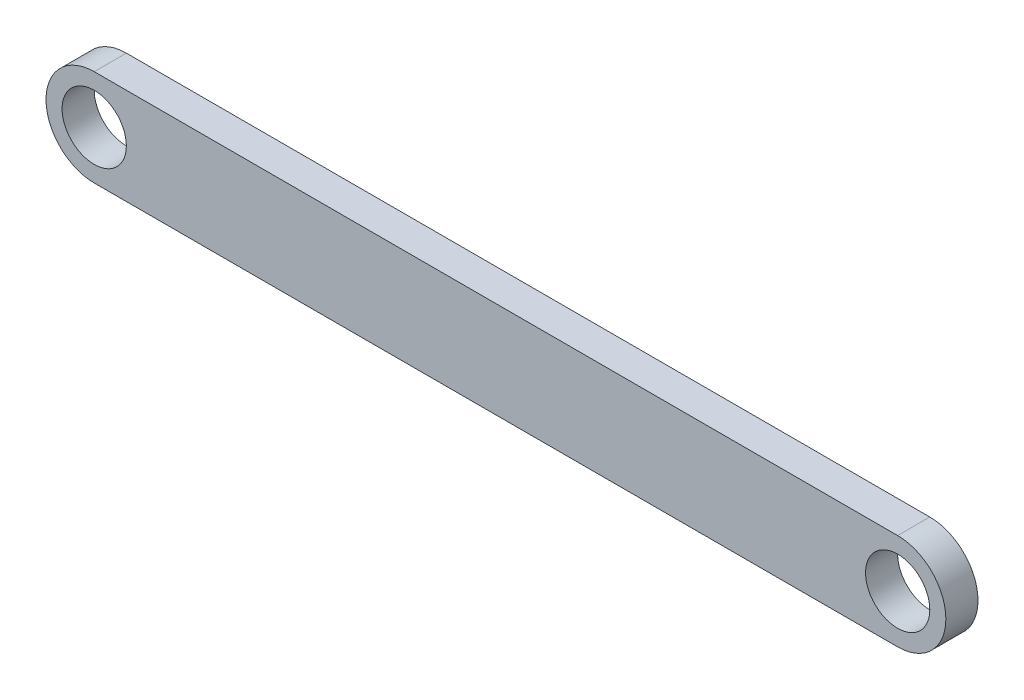
ISO-10303-21;
HEADER;
FILE_DESCRIPTION(('STEP AP214'),'2;1');
FILE_NAME('part.step','',(''),(''),'','','');
FILE_SCHEMA(('AUTOMOTIVE_DESIGN { 1 0 10303 214 1 1 1 1 }'));
ENDSEC;
DATA;
#1=APPLICATION_CONTEXT('core data for automotive mechanical design processes');
#2=APPLICATION_PROTOCOL_DEFINITION('international standard','automotive_design',2000,#1);
#3=PRODUCT_CONTEXT('',#1,'mechanical');
#4=PRODUCT('Part','Part','',(#3));
#5=PRODUCT_RELATED_PRODUCT_CATEGORY('part','',(#4));
#6=PRODUCT_DEFINITION_FORMATION('','',#4);
#7=PRODUCT_DEFINITION_CONTEXT('part definition',#1,'design');
#8=PRODUCT_DEFINITION('design','',#6,#7);
#9=PRODUCT_DEFINITION_SHAPE('','',#8);
#10=(LENGTH_UNIT() NAMED_UNIT(*) SI_UNIT(.MILLI.,.METRE.));
#11=(NAMED_UNIT(*) PLANE_ANGLE_UNIT() SI_UNIT($,.RADIAN.));
#12=(NAMED_UNIT(*) SI_UNIT($,.STERADIAN.) SOLID_ANGLE_UNIT());
#13=UNCERTAINTY_MEASURE_WITH_UNIT(LENGTH_MEASURE(1.E-05),#10,'distance_accuracy_value','');
#14=(GEOMETRIC_REPRESENTATION_CONTEXT(3) GLOBAL_UNCERTAINTY_ASSIGNED_CONTEXT((#13)) GLOBAL_UNIT_ASSIGNED_CONTEXT((#10,
#11,#12)) REPRESENTATION_CONTEXT('',''));
#15=CARTESIAN_POINT('',(0.,0.,0.));
#16=DIRECTION('',(0.,0.,1.));
#17=DIRECTION('',(1.,0.,0.));
#18=AXIS2_PLACEMENT_3D('',#15,#16,#17);
#19=CARTESIAN_POINT('',(0.,0.,10.));
#20=DIRECTION('',(0.,0.,1.));
#21=DIRECTION('',(1.,0.,0.));
#22=AXIS2_PLACEMENT_3D('',#19,#20,#21);
#23=PLANE('',#22);
#24=CARTESIAN_POINT('',(0.,0.,10.));
#25=DIRECTION('',(0.,0.,1.));
#26=DIRECTION('',(1.,0.,0.));
#27=AXIS2_PLACEMENT_3D('',#24,#25,#26);
#28=CIRCLE('',#27,10.);
#29=CARTESIAN_POINT('',(10.,0.,10.));
#30=VERTEX_POINT('',#29);
#31=EDGE_CURVE('E118',#30,#30,#28,.T.);
#32=ORIENTED_EDGE('',*,*,#31,.F.);
#33=EDGE_LOOP('',(#32));
#34=FACE_BOUND('',#33,.T.);
#35=CARTESIAN_POINT('',(0.,0.,10.));
#36=DIRECTION('',(0.,0.,1.));
#37=DIRECTION('',(1.,0.,0.));
#38=AXIS2_PLACEMENT_3D('',#35,#36,#37);
#39=CIRCLE('',#38,15.);
#40=CARTESIAN_POINT('',(0.,15.,10.));
#41=VERTEX_POINT('',#40);
#42=CARTESIAN_POINT('',(0.,-15.,10.));
#43=VERTEX_POINT('',#42);
#44=EDGE_CURVE('E98',#41,#43,#39,.T.);
#45=ORIENTED_EDGE('',*,*,#44,.T.);
#46=DIRECTION('',(1.,0.,0.));
#47=VECTOR('',#46,1.);
#48=CARTESIAN_POINT('',(0.,-15.,10.));
#49=LINE('',#48,#47);
#50=CARTESIAN_POINT('',(250.,-15.,10.));
#51=VERTEX_POINT('',#50);
#52=EDGE_CURVE('E93',#43,#51,#49,.T.);
#53=ORIENTED_EDGE('',*,*,#52,.T.);
#54=CARTESIAN_POINT('',(250.,0.,10.));
#55=DIRECTION('',(0.,0.,1.));
#56=DIRECTION('',(1.,0.,0.));
#57=AXIS2_PLACEMENT_3D('',#54,#55,#56);
#58=CIRCLE('',#57,15.);
#59=CARTESIAN_POINT('',(250.,15.,10.));
#60=VERTEX_POINT('',#59);
#61=EDGE_CURVE('E96',#51,#60,#58,.T.);
#62=ORIENTED_EDGE('',*,*,#61,.T.);
#63=DIRECTION('',(-1.,0.,0.));
#64=VECTOR('',#63,1.);
#65=CARTESIAN_POINT('',(0.,15.,10.));
#66=LINE('',#65,#64);
#67=EDGE_CURVE('E63',#60,#41,#66,.T.);
#68=ORIENTED_EDGE('',*,*,#67,.T.);
#69=EDGE_LOOP('',(#45,#53,#62,#68));
#70=FACE_BOUND('',#69,.T.);
#71=CARTESIAN_POINT('',(250.,0.,10.));
#72=DIRECTION('',(0.,0.,1.));
#73=DIRECTION('',(1.,0.,0.));
#74=AXIS2_PLACEMENT_3D('',#71,#72,#73);
#75=CIRCLE('',#74,9.99999999999998);
#76=CARTESIAN_POINT('',(260.,0.,10.));
#77=VERTEX_POINT('',#76);
#78=EDGE_CURVE('E140',#77,#77,#75,.T.);
#79=ORIENTED_EDGE('',*,*,#78,.F.);
#80=EDGE_LOOP('',(#79));
#81=FACE_BOUND('',#80,.T.);
#82=ADVANCED_FACE('F45',(#34,#70,#81),#23,.T.);
#83=CARTESIAN_POINT('',(0.,0.,0.));
#84=DIRECTION('',(0.,0.,1.));
#85=DIRECTION('',(1.,0.,0.));
#86=AXIS2_PLACEMENT_3D('',#83,#84,#85);
#87=PLANE('',#86);
#88=CARTESIAN_POINT('',(0.,0.,0.));
#89=DIRECTION('',(0.,0.,1.));
#90=DIRECTION('',(1.,0.,0.));
#91=AXIS2_PLACEMENT_3D('',#88,#89,#90);
#92=CIRCLE('',#91,15.);
#93=CARTESIAN_POINT('',(0.,15.,0.));
#94=VERTEX_POINT('',#93);
#95=CARTESIAN_POINT('',(0.,-15.,0.));
#96=VERTEX_POINT('',#95);
#97=EDGE_CURVE('E114',#94,#96,#92,.T.);
#98=ORIENTED_EDGE('',*,*,#97,.F.);
#99=DIRECTION('',(-1.,0.,0.));
#100=VECTOR('',#99,1.);
#101=CARTESIAN_POINT('',(0.,15.,0.));
#102=LINE('',#101,#100);
#103=CARTESIAN_POINT('',(250.,15.,0.));
#104=VERTEX_POINT('',#103);
#105=EDGE_CURVE('E86',#104,#94,#102,.T.);
#106=ORIENTED_EDGE('',*,*,#105,.F.);
#107=CARTESIAN_POINT('',(250.,0.,0.));
#108=DIRECTION('',(0.,0.,1.));
#109=DIRECTION('',(1.,0.,0.));
#110=AXIS2_PLACEMENT_3D('',#107,#108,#109);
#111=CIRCLE('',#110,15.);
#112=CARTESIAN_POINT('',(250.,-15.,0.));
#113=VERTEX_POINT('',#112);
#114=EDGE_CURVE('E80',#113,#104,#111,.T.);
#115=ORIENTED_EDGE('',*,*,#114,.F.);
#116=DIRECTION('',(1.,0.,0.));
#117=VECTOR('',#116,1.);
#118=CARTESIAN_POINT('',(0.,-15.,0.));
#119=LINE('',#118,#117);
#120=EDGE_CURVE('E103',#96,#113,#119,.T.);
#121=ORIENTED_EDGE('',*,*,#120,.F.);
#122=EDGE_LOOP('',(#98,#106,#115,#121));
#123=FACE_BOUND('',#122,.T.);
#124=CARTESIAN_POINT('',(0.,0.,0.));
#125=DIRECTION('',(0.,0.,1.));
#126=DIRECTION('',(1.,0.,0.));
#127=AXIS2_PLACEMENT_3D('',#124,#125,#126);
#128=CIRCLE('',#127,10.);
#129=CARTESIAN_POINT('',(10.,0.,0.));
#130=VERTEX_POINT('',#129);
#131=EDGE_CURVE('E136',#130,#130,#128,.T.);
#132=ORIENTED_EDGE('',*,*,#131,.T.);
#133=EDGE_LOOP('',(#132));
#134=FACE_BOUND('',#133,.T.);
#135=CARTESIAN_POINT('',(250.,0.,0.));
#136=DIRECTION('',(0.,0.,1.));
#137=DIRECTION('',(1.,0.,0.));
#138=AXIS2_PLACEMENT_3D('',#135,#136,#137);
#139=CIRCLE('',#138,9.99999999999998);
#140=CARTESIAN_POINT('',(260.,0.,0.));
#141=VERTEX_POINT('',#140);
#142=EDGE_CURVE('E144',#141,#141,#139,.T.);
#143=ORIENTED_EDGE('',*,*,#142,.T.);
#144=EDGE_LOOP('',(#143));
#145=FACE_BOUND('',#144,.T.);
#146=ADVANCED_FACE('F131',(#123,#134,#145),#87,.F.);
#147=CARTESIAN_POINT('',(0.,0.,10.));
#148=DIRECTION('',(0.,0.,-1.));
#149=DIRECTION('',(-1.,0.,0.));
#150=AXIS2_PLACEMENT_3D('',#147,#148,#149);
#151=CYLINDRICAL_SURFACE('',#150,15.);
#152=ORIENTED_EDGE('',*,*,#97,.T.);
#153=DIRECTION('',(0.,0.,-1.));
#154=VECTOR('',#153,1.);
#155=CARTESIAN_POINT('',(0.,-15.,10.));
#156=LINE('',#155,#154);
#157=EDGE_CURVE('E11',#43,#96,#156,.T.);
#158=ORIENTED_EDGE('',*,*,#157,.F.);
#159=ORIENTED_EDGE('',*,*,#44,.F.);
#160=DIRECTION('',(0.,0.,-1.));
#161=VECTOR('',#160,1.);
#162=CARTESIAN_POINT('',(0.,15.,10.));
#163=LINE('',#162,#161);
#164=EDGE_CURVE('E110',#41,#94,#163,.T.);
#165=ORIENTED_EDGE('',*,*,#164,.T.);
#166=EDGE_LOOP('',(#152,#158,#159,#165));
#167=FACE_BOUND('',#166,.T.);
#168=ADVANCED_FACE('F47',(#167),#151,.T.);
#169=CARTESIAN_POINT('',(0.,-15.,10.));
#170=DIRECTION('',(0.,1.,0.));
#171=DIRECTION('',(0.,0.,1.));
#172=AXIS2_PLACEMENT_3D('',#169,#170,#171);
#173=PLANE('',#172);
#174=ORIENTED_EDGE('',*,*,#120,.T.);
#175=DIRECTION('',(0.,0.,-1.));
#176=VECTOR('',#175,1.);
#177=CARTESIAN_POINT('',(250.,-15.,10.));
#178=LINE('',#177,#176);
#179=EDGE_CURVE('E55',#51,#113,#178,.T.);
#180=ORIENTED_EDGE('',*,*,#179,.F.);
#181=ORIENTED_EDGE('',*,*,#52,.F.);
#182=ORIENTED_EDGE('',*,*,#157,.T.);
#183=EDGE_LOOP('',(#174,#180,#181,#182));
#184=FACE_BOUND('',#183,.T.);
#185=ADVANCED_FACE('F102',(#184),#173,.F.);
#186=CARTESIAN_POINT('',(250.,0.,10.));
#187=DIRECTION('',(0.,0.,-1.));
#188=DIRECTION('',(-1.,0.,0.));
#189=AXIS2_PLACEMENT_3D('',#186,#187,#188);
#190=CYLINDRICAL_SURFACE('',#189,15.);
#191=ORIENTED_EDGE('',*,*,#114,.T.);
#192=DIRECTION('',(0.,0.,-1.));
#193=VECTOR('',#192,1.);
#194=CARTESIAN_POINT('',(250.,15.,10.));
#195=LINE('',#194,#193);
#196=EDGE_CURVE('E105',#60,#104,#195,.T.);
#197=ORIENTED_EDGE('',*,*,#196,.F.);
#198=ORIENTED_EDGE('',*,*,#61,.F.);
#199=ORIENTED_EDGE('',*,*,#179,.T.);
#200=EDGE_LOOP('',(#191,#197,#198,#199));
#201=FACE_BOUND('',#200,.T.);
#202=ADVANCED_FACE('F106',(#201),#190,.T.);
#203=CARTESIAN_POINT('',(0.,15.,10.));
#204=DIRECTION('',(0.,-1.,0.));
#205=DIRECTION('',(0.,0.,-1.));
#206=AXIS2_PLACEMENT_3D('',#203,#204,#205);
#207=PLANE('',#206);
#208=ORIENTED_EDGE('',*,*,#105,.T.);
#209=ORIENTED_EDGE('',*,*,#164,.F.);
#210=ORIENTED_EDGE('',*,*,#67,.F.);
#211=ORIENTED_EDGE('',*,*,#196,.T.);
#212=EDGE_LOOP('',(#208,#209,#210,#211));
#213=FACE_BOUND('',#212,.T.);
#214=ADVANCED_FACE('F128',(#213),#207,.F.);
#215=CARTESIAN_POINT('',(0.,0.,10.));
#216=DIRECTION('',(0.,0.,-1.));
#217=DIRECTION('',(-1.,0.,0.));
#218=AXIS2_PLACEMENT_3D('',#215,#216,#217);
#219=CYLINDRICAL_SURFACE('',#218,10.);
#220=ORIENTED_EDGE('',*,*,#31,.T.);
#221=EDGE_LOOP('',(#220));
#222=FACE_BOUND('',#221,.T.);
#223=ORIENTED_EDGE('',*,*,#131,.F.);
#224=EDGE_LOOP('',(#223));
#225=FACE_BOUND('',#224,.T.);
#226=ADVANCED_FACE('F163',(#222,#225),#219,.F.);
#227=CARTESIAN_POINT('',(250.,0.,10.));
#228=DIRECTION('',(0.,0.,-1.));
#229=DIRECTION('',(-1.,0.,0.));
#230=AXIS2_PLACEMENT_3D('',#227,#228,#229);
#231=CYLINDRICAL_SURFACE('',#230,9.99999999999998);
#232=ORIENTED_EDGE('',*,*,#78,.T.);
#233=EDGE_LOOP('',(#232));
#234=FACE_BOUND('',#233,.T.);
#235=ORIENTED_EDGE('',*,*,#142,.F.);
#236=EDGE_LOOP('',(#235));
#237=FACE_BOUND('',#236,.T.);
#238=ADVANCED_FACE('F152',(#234,#237),#231,.F.);
#239=CLOSED_SHELL('',(#82,#146,#168,#185,#202,#214,#226,#238));
#240=MANIFOLD_SOLID_BREP('B2',#239);
#241=ADVANCED_BREP_SHAPE_REPRESENTATION('',(#18,#240),#14);
#242=SHAPE_DEFINITION_REPRESENTATION(#9,#241);
ENDSEC;
END-ISO-10303-21;
